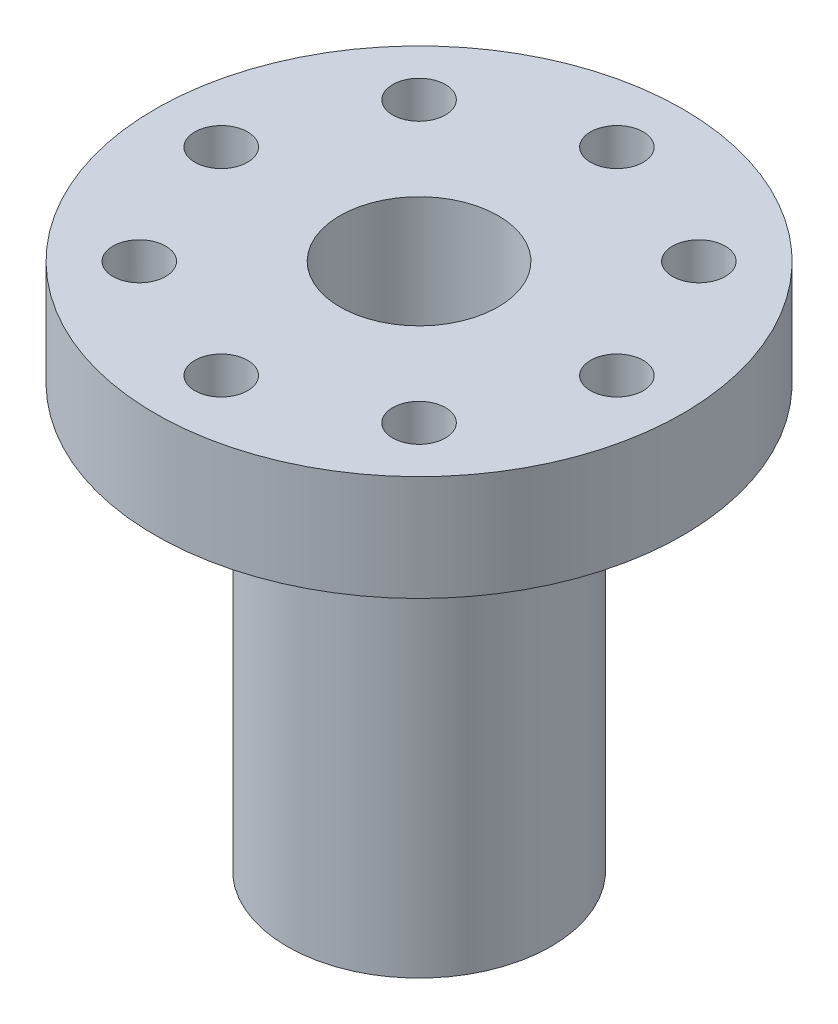
ISO-10303-21;
HEADER;
FILE_DESCRIPTION(('STEP AP214'),'2;1');
FILE_NAME('part.step','',(''),(''),'','','');
FILE_SCHEMA(('AUTOMOTIVE_DESIGN { 1 0 10303 214 1 1 1 1 }'));
ENDSEC;
DATA;
#1=APPLICATION_CONTEXT('core data for automotive mechanical design processes');
#2=APPLICATION_PROTOCOL_DEFINITION('international standard','automotive_design',2000,#1);
#3=PRODUCT_CONTEXT('',#1,'mechanical');
#4=PRODUCT('Part','Part','',(#3));
#5=PRODUCT_RELATED_PRODUCT_CATEGORY('part','',(#4));
#6=PRODUCT_DEFINITION_FORMATION('','',#4);
#7=PRODUCT_DEFINITION_CONTEXT('part definition',#1,'design');
#8=PRODUCT_DEFINITION('design','',#6,#7);
#9=PRODUCT_DEFINITION_SHAPE('','',#8);
#10=(LENGTH_UNIT() NAMED_UNIT(*) SI_UNIT(.MILLI.,.METRE.));
#11=(NAMED_UNIT(*) PLANE_ANGLE_UNIT() SI_UNIT($,.RADIAN.));
#12=(NAMED_UNIT(*) SI_UNIT($,.STERADIAN.) SOLID_ANGLE_UNIT());
#13=UNCERTAINTY_MEASURE_WITH_UNIT(LENGTH_MEASURE(1.E-05),#10,'distance_accuracy_value','');
#14=(GEOMETRIC_REPRESENTATION_CONTEXT(3) GLOBAL_UNCERTAINTY_ASSIGNED_CONTEXT((#13)) GLOBAL_UNIT_ASSIGNED_CONTEXT((#10,
#11,#12)) REPRESENTATION_CONTEXT('',''));
#15=CARTESIAN_POINT('',(0.,0.,0.));
#16=DIRECTION('',(0.,0.,1.));
#17=DIRECTION('',(1.,0.,0.));
#18=AXIS2_PLACEMENT_3D('',#15,#16,#17);
#19=CARTESIAN_POINT('',(0.,0.,0.));
#20=DIRECTION('',(0.,-1.,0.));
#21=DIRECTION('',(0.,0.,-1.));
#22=AXIS2_PLACEMENT_3D('',#19,#20,#21);
#23=CYLINDRICAL_SURFACE('',#22,0.635);
#24=CARTESIAN_POINT('',(0.,4.572,0.));
#25=DIRECTION('',(0.,-1.,0.));
#26=DIRECTION('',(0.,0.,-1.));
#27=AXIS2_PLACEMENT_3D('',#24,#25,#26);
#28=CIRCLE('',#27,0.635);
#29=CARTESIAN_POINT('',(0.,4.572,-0.635));
#30=VERTEX_POINT('',#29);
#31=EDGE_CURVE('E47',#30,#30,#28,.T.);
#32=ORIENTED_EDGE('',*,*,#31,.F.);
#33=EDGE_LOOP('',(#32));
#34=FACE_BOUND('',#33,.T.);
#35=CARTESIAN_POINT('',(0.,3.5052,0.));
#36=DIRECTION('',(0.,-1.,0.));
#37=DIRECTION('',(0.,0.,-1.));
#38=AXIS2_PLACEMENT_3D('',#35,#36,#37);
#39=CIRCLE('',#38,0.635);
#40=CARTESIAN_POINT('',(0.,3.5052,-0.635));
#41=VERTEX_POINT('',#40);
#42=EDGE_CURVE('E51',#41,#41,#39,.T.);
#43=ORIENTED_EDGE('',*,*,#42,.T.);
#44=EDGE_LOOP('',(#43));
#45=FACE_BOUND('',#44,.T.);
#46=ADVANCED_FACE('F34',(#34,#45),#23,.F.);
#47=CARTESIAN_POINT('',(12.7,25.4,0.));
#48=DIRECTION('',(0.,1.,0.));
#49=DIRECTION('',(0.,0.,1.));
#50=AXIS2_PLACEMENT_3D('',#47,#48,#49);
#51=PLANE('',#50);
#52=CARTESIAN_POINT('',(9.525,25.4,0.));
#53=DIRECTION('',(0.,1.,0.));
#54=DIRECTION('',(-1.,0.,0.));
#55=AXIS2_PLACEMENT_3D('',#52,#53,#54);
#56=CIRCLE('',#55,1.27);
#57=CARTESIAN_POINT('',(8.255,25.4,0.));
#58=VERTEX_POINT('',#57);
#59=EDGE_CURVE('E70',#58,#58,#56,.T.);
#60=ORIENTED_EDGE('',*,*,#59,.F.);
#61=EDGE_LOOP('',(#60));
#62=FACE_BOUND('',#61,.T.);
#63=CARTESIAN_POINT('',(6.73519209080183,25.4,6.7351920908019));
#64=DIRECTION('',(0.,1.,0.));
#65=DIRECTION('',(-0.707106781186544,0.,-0.707106781186551));
#66=AXIS2_PLACEMENT_3D('',#63,#64,#65);
#67=CIRCLE('',#66,1.27);
#68=CARTESIAN_POINT('',(5.83716647869492,25.4,5.83716647869498));
#69=VERTEX_POINT('',#68);
#70=EDGE_CURVE('E173',#69,#69,#67,.T.);
#71=ORIENTED_EDGE('',*,*,#70,.F.);
#72=EDGE_LOOP('',(#71));
#73=FACE_BOUND('',#72,.T.);
#74=CARTESIAN_POINT('',(0.,25.4,9.525));
#75=DIRECTION('',(0.,1.,0.));
#76=DIRECTION('',(0.,0.,-1.));
#77=AXIS2_PLACEMENT_3D('',#74,#75,#76);
#78=CIRCLE('',#77,1.27);
#79=CARTESIAN_POINT('',(0.,25.4,8.255));
#80=VERTEX_POINT('',#79);
#81=EDGE_CURVE('E177',#80,#80,#78,.T.);
#82=ORIENTED_EDGE('',*,*,#81,.F.);
#83=EDGE_LOOP('',(#82));
#84=FACE_BOUND('',#83,.T.);
#85=CARTESIAN_POINT('',(-6.73519209080192,25.4,6.73519209080181));
#86=DIRECTION('',(0.,1.,0.));
#87=DIRECTION('',(0.707106781186554,0.,-0.707106781186541));
#88=AXIS2_PLACEMENT_3D('',#85,#86,#87);
#89=CIRCLE('',#88,1.27);
#90=CARTESIAN_POINT('',(-5.837166478695,25.4,5.8371664786949));
#91=VERTEX_POINT('',#90);
#92=EDGE_CURVE('E181',#91,#91,#89,.T.);
#93=ORIENTED_EDGE('',*,*,#92,.F.);
#94=EDGE_LOOP('',(#93));
#95=FACE_BOUND('',#94,.T.);
#96=CARTESIAN_POINT('',(-9.525,25.4,0.));
#97=DIRECTION('',(0.,1.,0.));
#98=DIRECTION('',(1.,0.,0.));
#99=AXIS2_PLACEMENT_3D('',#96,#97,#98);
#100=CIRCLE('',#99,1.27);
#101=CARTESIAN_POINT('',(-8.255,25.4,0.));
#102=VERTEX_POINT('',#101);
#103=EDGE_CURVE('E185',#102,#102,#100,.T.);
#104=ORIENTED_EDGE('',*,*,#103,.F.);
#105=EDGE_LOOP('',(#104));
#106=FACE_BOUND('',#105,.T.);
#107=CARTESIAN_POINT('',(-6.73519209080178,25.4,-6.73519209080195));
#108=DIRECTION('',(0.,1.,0.));
#109=DIRECTION('',(0.707106781186539,0.,0.707106781186556));
#110=AXIS2_PLACEMENT_3D('',#107,#108,#109);
#111=CIRCLE('',#110,1.27);
#112=CARTESIAN_POINT('',(-5.83716647869488,25.4,-5.83716647869502));
#113=VERTEX_POINT('',#112);
#114=EDGE_CURVE('E92',#113,#113,#111,.T.);
#115=ORIENTED_EDGE('',*,*,#114,.F.);
#116=EDGE_LOOP('',(#115));
#117=FACE_BOUND('',#116,.T.);
#118=CARTESIAN_POINT('',(6.73519209080188,25.4,-6.73519209080185));
#119=DIRECTION('',(0.,1.,0.));
#120=DIRECTION('',(-0.707106781186549,0.,0.707106781186546));
#121=AXIS2_PLACEMENT_3D('',#118,#119,#120);
#122=CIRCLE('',#121,1.27);
#123=CARTESIAN_POINT('',(5.83716647869496,25.4,-5.83716647869494));
#124=VERTEX_POINT('',#123);
#125=EDGE_CURVE('E64',#124,#124,#122,.T.);
#126=ORIENTED_EDGE('',*,*,#125,.F.);
#127=EDGE_LOOP('',(#126));
#128=FACE_BOUND('',#127,.T.);
#129=CARTESIAN_POINT('',(0.,25.4,-9.525));
#130=DIRECTION('',(0.,1.,0.));
#131=DIRECTION('',(0.,0.,1.));
#132=AXIS2_PLACEMENT_3D('',#129,#130,#131);
#133=CIRCLE('',#132,1.27);
#134=CARTESIAN_POINT('',(0.,25.4,-8.255));
#135=VERTEX_POINT('',#134);
#136=EDGE_CURVE('E60',#135,#135,#133,.T.);
#137=ORIENTED_EDGE('',*,*,#136,.F.);
#138=EDGE_LOOP('',(#137));
#139=FACE_BOUND('',#138,.T.);
#140=CARTESIAN_POINT('',(0.,25.4,0.));
#141=DIRECTION('',(0.,-1.,0.));
#142=DIRECTION('',(0.,0.,-1.));
#143=AXIS2_PLACEMENT_3D('',#140,#141,#142);
#144=CIRCLE('',#143,3.81);
#145=CARTESIAN_POINT('',(0.,25.4,-3.81));
#146=VERTEX_POINT('',#145);
#147=EDGE_CURVE('E10',#146,#146,#144,.T.);
#148=ORIENTED_EDGE('',*,*,#147,.T.);
#149=EDGE_LOOP('',(#148));
#150=FACE_BOUND('',#149,.T.);
#151=CARTESIAN_POINT('',(0.,25.4,0.));
#152=DIRECTION('',(0.,-1.,0.));
#153=DIRECTION('',(0.,0.,-1.));
#154=AXIS2_PLACEMENT_3D('',#151,#152,#153);
#155=CIRCLE('',#154,12.7);
#156=CARTESIAN_POINT('',(0.,25.4,-12.7));
#157=VERTEX_POINT('',#156);
#158=EDGE_CURVE('E54',#157,#157,#155,.T.);
#159=ORIENTED_EDGE('',*,*,#158,.F.);
#160=EDGE_LOOP('',(#159));
#161=FACE_BOUND('',#160,.T.);
#162=ADVANCED_FACE('F36',(#62,#73,#84,#95,#106,#117,#128,#139,#150,#161),#51,.T.);
#163=CARTESIAN_POINT('',(0.,0.,0.));
#164=DIRECTION('',(0.,-1.,0.));
#165=DIRECTION('',(0.,0.,-1.));
#166=AXIS2_PLACEMENT_3D('',#163,#164,#165);
#167=CYLINDRICAL_SURFACE('',#166,3.81);
#168=CARTESIAN_POINT('',(0.,4.572,0.));
#169=DIRECTION('',(0.,-1.,0.));
#170=DIRECTION('',(0.,0.,-1.));
#171=AXIS2_PLACEMENT_3D('',#168,#169,#170);
#172=CIRCLE('',#171,3.81);
#173=CARTESIAN_POINT('',(0.,4.572,-3.81));
#174=VERTEX_POINT('',#173);
#175=EDGE_CURVE('E42',#174,#174,#172,.T.);
#176=ORIENTED_EDGE('',*,*,#175,.T.);
#177=EDGE_LOOP('',(#176));
#178=FACE_BOUND('',#177,.T.);
#179=ORIENTED_EDGE('',*,*,#147,.F.);
#180=EDGE_LOOP('',(#179));
#181=FACE_BOUND('',#180,.T.);
#182=ADVANCED_FACE('F156',(#178,#181),#167,.F.);
#183=CARTESIAN_POINT('',(3.81,4.572,0.));
#184=DIRECTION('',(0.,1.,0.));
#185=DIRECTION('',(0.,0.,1.));
#186=AXIS2_PLACEMENT_3D('',#183,#184,#185);
#187=PLANE('',#186);
#188=ORIENTED_EDGE('',*,*,#31,.T.);
#189=EDGE_LOOP('',(#188));
#190=FACE_BOUND('',#189,.T.);
#191=ORIENTED_EDGE('',*,*,#175,.F.);
#192=EDGE_LOOP('',(#191));
#193=FACE_BOUND('',#192,.T.);
#194=ADVANCED_FACE('F115',(#190,#193),#187,.T.);
#195=CARTESIAN_POINT('',(0.635000000000001,0.,0.));
#196=DIRECTION('',(0.,-1.,0.));
#197=DIRECTION('',(0.,0.,-1.));
#198=AXIS2_PLACEMENT_3D('',#195,#196,#197);
#199=PLANE('',#198);
#200=CARTESIAN_POINT('',(0.,0.,0.));
#201=DIRECTION('',(0.,-1.,0.));
#202=DIRECTION('',(0.,0.,-1.));
#203=AXIS2_PLACEMENT_3D('',#200,#201,#202);
#204=CIRCLE('',#203,2.54);
#205=CARTESIAN_POINT('',(0.,0.,-2.54));
#206=VERTEX_POINT('',#205);
#207=EDGE_CURVE('E59',#206,#206,#204,.T.);
#208=ORIENTED_EDGE('',*,*,#207,.F.);
#209=EDGE_LOOP('',(#208));
#210=FACE_BOUND('',#209,.T.);
#211=CARTESIAN_POINT('',(0.,0.,0.));
#212=DIRECTION('',(0.,-1.,0.));
#213=DIRECTION('',(0.,0.,-1.));
#214=AXIS2_PLACEMENT_3D('',#211,#212,#213);
#215=CIRCLE('',#214,6.35);
#216=CARTESIAN_POINT('',(0.,0.,-6.35));
#217=VERTEX_POINT('',#216);
#218=EDGE_CURVE('E110',#217,#217,#215,.T.);
#219=ORIENTED_EDGE('',*,*,#218,.T.);
#220=EDGE_LOOP('',(#219));
#221=FACE_BOUND('',#220,.T.);
#222=ADVANCED_FACE('F137',(#210,#221),#199,.T.);
#223=CARTESIAN_POINT('',(0.,0.,0.));
#224=DIRECTION('',(0.,-1.,0.));
#225=DIRECTION('',(0.,0.,-1.));
#226=AXIS2_PLACEMENT_3D('',#223,#224,#225);
#227=CYLINDRICAL_SURFACE('',#226,6.35);
#228=CARTESIAN_POINT('',(0.,20.32,0.));
#229=DIRECTION('',(0.,-1.,0.));
#230=DIRECTION('',(0.,0.,-1.));
#231=AXIS2_PLACEMENT_3D('',#228,#229,#230);
#232=CIRCLE('',#231,6.35);
#233=CARTESIAN_POINT('',(0.,20.32,-6.35));
#234=VERTEX_POINT('',#233);
#235=EDGE_CURVE('E107',#234,#234,#232,.T.);
#236=ORIENTED_EDGE('',*,*,#235,.T.);
#237=EDGE_LOOP('',(#236));
#238=FACE_BOUND('',#237,.T.);
#239=ORIENTED_EDGE('',*,*,#218,.F.);
#240=EDGE_LOOP('',(#239));
#241=FACE_BOUND('',#240,.T.);
#242=ADVANCED_FACE('F140',(#238,#241),#227,.T.);
#243=CARTESIAN_POINT('',(6.35,20.32,0.));
#244=DIRECTION('',(0.,-1.,0.));
#245=DIRECTION('',(0.,0.,-1.));
#246=AXIS2_PLACEMENT_3D('',#243,#244,#245);
#247=PLANE('',#246);
#248=CARTESIAN_POINT('',(9.525,20.32,0.));
#249=DIRECTION('',(0.,-1.,0.));
#250=DIRECTION('',(0.,0.,-1.));
#251=AXIS2_PLACEMENT_3D('',#248,#249,#250);
#252=CIRCLE('',#251,1.27);
#253=CARTESIAN_POINT('',(9.525,20.32,-1.26999999999997));
#254=VERTEX_POINT('',#253);
#255=EDGE_CURVE('E38',#254,#254,#252,.T.);
#256=ORIENTED_EDGE('',*,*,#255,.F.);
#257=EDGE_LOOP('',(#256));
#258=FACE_BOUND('',#257,.T.);
#259=CARTESIAN_POINT('',(6.73519209080183,20.32,6.7351920908019));
#260=DIRECTION('',(0.,-1.,0.));
#261=DIRECTION('',(0.,0.,-1.));
#262=AXIS2_PLACEMENT_3D('',#259,#260,#261);
#263=CIRCLE('',#262,1.27);
#264=CARTESIAN_POINT('',(6.73519209080183,20.32,5.4651920908019));
#265=VERTEX_POINT('',#264);
#266=EDGE_CURVE('E79',#265,#265,#263,.T.);
#267=ORIENTED_EDGE('',*,*,#266,.F.);
#268=EDGE_LOOP('',(#267));
#269=FACE_BOUND('',#268,.T.);
#270=CARTESIAN_POINT('',(0.,20.32,9.525));
#271=DIRECTION('',(0.,-1.,0.));
#272=DIRECTION('',(0.,0.,-1.));
#273=AXIS2_PLACEMENT_3D('',#270,#271,#272);
#274=CIRCLE('',#273,1.27);
#275=CARTESIAN_POINT('',(0.,20.32,8.255));
#276=VERTEX_POINT('',#275);
#277=EDGE_CURVE('E77',#276,#276,#274,.T.);
#278=ORIENTED_EDGE('',*,*,#277,.F.);
#279=EDGE_LOOP('',(#278));
#280=FACE_BOUND('',#279,.T.);
#281=CARTESIAN_POINT('',(-6.73519209080192,20.32,6.73519209080181));
#282=DIRECTION('',(0.,-1.,0.));
#283=DIRECTION('',(0.,0.,-1.));
#284=AXIS2_PLACEMENT_3D('',#281,#282,#283);
#285=CIRCLE('',#284,1.27);
#286=CARTESIAN_POINT('',(-6.73519209080192,20.32,5.46519209080181));
#287=VERTEX_POINT('',#286);
#288=EDGE_CURVE('E74',#287,#287,#285,.T.);
#289=ORIENTED_EDGE('',*,*,#288,.F.);
#290=EDGE_LOOP('',(#289));
#291=FACE_BOUND('',#290,.T.);
#292=CARTESIAN_POINT('',(-9.525,20.32,0.));
#293=DIRECTION('',(0.,-1.,0.));
#294=DIRECTION('',(0.,0.,-1.));
#295=AXIS2_PLACEMENT_3D('',#292,#293,#294);
#296=CIRCLE('',#295,1.27);
#297=CARTESIAN_POINT('',(-9.525,20.32,-1.2700000000001));
#298=VERTEX_POINT('',#297);
#299=EDGE_CURVE('E69',#298,#298,#296,.T.);
#300=ORIENTED_EDGE('',*,*,#299,.F.);
#301=EDGE_LOOP('',(#300));
#302=FACE_BOUND('',#301,.T.);
#303=CARTESIAN_POINT('',(-6.73519209080178,20.32,-6.73519209080195));
#304=DIRECTION('',(0.,-1.,0.));
#305=DIRECTION('',(0.,0.,-1.));
#306=AXIS2_PLACEMENT_3D('',#303,#304,#305);
#307=CIRCLE('',#306,1.27);
#308=CARTESIAN_POINT('',(-6.73519209080178,20.32,-8.00519209080195));
#309=VERTEX_POINT('',#308);
#310=EDGE_CURVE('E65',#309,#309,#307,.T.);
#311=ORIENTED_EDGE('',*,*,#310,.F.);
#312=EDGE_LOOP('',(#311));
#313=FACE_BOUND('',#312,.T.);
#314=CARTESIAN_POINT('',(6.73519209080188,20.32,-6.73519209080185));
#315=DIRECTION('',(0.,-1.,0.));
#316=DIRECTION('',(0.,0.,-1.));
#317=AXIS2_PLACEMENT_3D('',#314,#315,#316);
#318=CIRCLE('',#317,1.27);
#319=CARTESIAN_POINT('',(6.73519209080188,20.32,-8.00519209080186));
#320=VERTEX_POINT('',#319);
#321=EDGE_CURVE('E61',#320,#320,#318,.T.);
#322=ORIENTED_EDGE('',*,*,#321,.F.);
#323=EDGE_LOOP('',(#322));
#324=FACE_BOUND('',#323,.T.);
#325=CARTESIAN_POINT('',(0.,20.32,-9.525));
#326=DIRECTION('',(0.,-1.,0.));
#327=DIRECTION('',(0.,0.,-1.));
#328=AXIS2_PLACEMENT_3D('',#325,#326,#327);
#329=CIRCLE('',#328,1.27);
#330=CARTESIAN_POINT('',(0.,20.32,-10.795));
#331=VERTEX_POINT('',#330);
#332=EDGE_CURVE('E56',#331,#331,#329,.T.);
#333=ORIENTED_EDGE('',*,*,#332,.F.);
#334=EDGE_LOOP('',(#333));
#335=FACE_BOUND('',#334,.T.);
#336=CARTESIAN_POINT('',(0.,20.32,0.));
#337=DIRECTION('',(0.,-1.,0.));
#338=DIRECTION('',(0.,0.,-1.));
#339=AXIS2_PLACEMENT_3D('',#336,#337,#338);
#340=CIRCLE('',#339,12.7);
#341=CARTESIAN_POINT('',(0.,20.32,-12.7));
#342=VERTEX_POINT('',#341);
#343=EDGE_CURVE('E103',#342,#342,#340,.T.);
#344=ORIENTED_EDGE('',*,*,#343,.T.);
#345=EDGE_LOOP('',(#344));
#346=FACE_BOUND('',#345,.T.);
#347=ORIENTED_EDGE('',*,*,#235,.F.);
#348=EDGE_LOOP('',(#347));
#349=FACE_BOUND('',#348,.T.);
#350=ADVANCED_FACE('F145',(#258,#269,#280,#291,#302,#313,#324,#335,#346,#349),#247,.T.);
#351=CARTESIAN_POINT('',(0.,0.,0.));
#352=DIRECTION('',(0.,-1.,0.));
#353=DIRECTION('',(0.,0.,-1.));
#354=AXIS2_PLACEMENT_3D('',#351,#352,#353);
#355=CYLINDRICAL_SURFACE('',#354,12.7);
#356=ORIENTED_EDGE('',*,*,#158,.T.);
#357=EDGE_LOOP('',(#356));
#358=FACE_BOUND('',#357,.T.);
#359=ORIENTED_EDGE('',*,*,#343,.F.);
#360=EDGE_LOOP('',(#359));
#361=FACE_BOUND('',#360,.T.);
#362=ADVANCED_FACE('F133',(#358,#361),#355,.T.);
#363=CARTESIAN_POINT('',(0.,3.5052,0.));
#364=DIRECTION('',(0.,-1.,0.));
#365=DIRECTION('',(0.,0.,-1.));
#366=AXIS2_PLACEMENT_3D('',#363,#364,#365);
#367=CYLINDRICAL_SURFACE('',#366,2.54);
#368=CARTESIAN_POINT('',(0.,3.5052,0.));
#369=DIRECTION('',(0.,-1.,0.));
#370=DIRECTION('',(0.,0.,-1.));
#371=AXIS2_PLACEMENT_3D('',#368,#369,#370);
#372=CIRCLE('',#371,2.54);
#373=CARTESIAN_POINT('',(0.,3.5052,-2.54));
#374=VERTEX_POINT('',#373);
#375=EDGE_CURVE('E55',#374,#374,#372,.T.);
#376=ORIENTED_EDGE('',*,*,#375,.F.);
#377=EDGE_LOOP('',(#376));
#378=FACE_BOUND('',#377,.T.);
#379=ORIENTED_EDGE('',*,*,#207,.T.);
#380=EDGE_LOOP('',(#379));
#381=FACE_BOUND('',#380,.T.);
#382=ADVANCED_FACE('F127',(#378,#381),#367,.F.);
#383=CARTESIAN_POINT('',(0.,3.5052,0.));
#384=DIRECTION('',(0.,-1.,0.));
#385=DIRECTION('',(0.,0.,-1.));
#386=AXIS2_PLACEMENT_3D('',#383,#384,#385);
#387=PLANE('',#386);
#388=ORIENTED_EDGE('',*,*,#42,.F.);
#389=EDGE_LOOP('',(#388));
#390=FACE_BOUND('',#389,.T.);
#391=ORIENTED_EDGE('',*,*,#375,.T.);
#392=EDGE_LOOP('',(#391));
#393=FACE_BOUND('',#392,.T.);
#394=ADVANCED_FACE('F123',(#390,#393),#387,.T.);
#395=CARTESIAN_POINT('',(0.,0.,-9.525));
#396=DIRECTION('',(0.,1.,0.));
#397=DIRECTION('',(0.,0.,1.));
#398=AXIS2_PLACEMENT_3D('',#395,#396,#397);
#399=CYLINDRICAL_SURFACE('',#398,1.27);
#400=ORIENTED_EDGE('',*,*,#332,.T.);
#401=EDGE_LOOP('',(#400));
#402=FACE_BOUND('',#401,.T.);
#403=ORIENTED_EDGE('',*,*,#136,.T.);
#404=EDGE_LOOP('',(#403));
#405=FACE_BOUND('',#404,.T.);
#406=ADVANCED_FACE('F126',(#402,#405),#399,.F.);
#407=CARTESIAN_POINT('',(6.73519209080188,0.,-6.73519209080185));
#408=DIRECTION('',(0.,1.,0.));
#409=DIRECTION('',(0.,0.,1.));
#410=AXIS2_PLACEMENT_3D('',#407,#408,#409);
#411=CYLINDRICAL_SURFACE('',#410,1.27);
#412=ORIENTED_EDGE('',*,*,#321,.T.);
#413=EDGE_LOOP('',(#412));
#414=FACE_BOUND('',#413,.T.);
#415=ORIENTED_EDGE('',*,*,#125,.T.);
#416=EDGE_LOOP('',(#415));
#417=FACE_BOUND('',#416,.T.);
#418=ADVANCED_FACE('F205',(#414,#417),#411,.F.);
#419=CARTESIAN_POINT('',(-6.73519209080178,0.,-6.73519209080195));
#420=DIRECTION('',(0.,1.,0.));
#421=DIRECTION('',(0.,0.,1.));
#422=AXIS2_PLACEMENT_3D('',#419,#420,#421);
#423=CYLINDRICAL_SURFACE('',#422,1.27);
#424=ORIENTED_EDGE('',*,*,#310,.T.);
#425=EDGE_LOOP('',(#424));
#426=FACE_BOUND('',#425,.T.);
#427=ORIENTED_EDGE('',*,*,#114,.T.);
#428=EDGE_LOOP('',(#427));
#429=FACE_BOUND('',#428,.T.);
#430=ADVANCED_FACE('F209',(#426,#429),#423,.F.);
#431=CARTESIAN_POINT('',(-9.525,0.,0.));
#432=DIRECTION('',(0.,1.,0.));
#433=DIRECTION('',(0.,0.,1.));
#434=AXIS2_PLACEMENT_3D('',#431,#432,#433);
#435=CYLINDRICAL_SURFACE('',#434,1.27);
#436=ORIENTED_EDGE('',*,*,#299,.T.);
#437=EDGE_LOOP('',(#436));
#438=FACE_BOUND('',#437,.T.);
#439=ORIENTED_EDGE('',*,*,#103,.T.);
#440=EDGE_LOOP('',(#439));
#441=FACE_BOUND('',#440,.T.);
#442=ADVANCED_FACE('F213',(#438,#441),#435,.F.);
#443=CARTESIAN_POINT('',(-6.73519209080192,0.,6.73519209080181));
#444=DIRECTION('',(0.,1.,0.));
#445=DIRECTION('',(0.,0.,1.));
#446=AXIS2_PLACEMENT_3D('',#443,#444,#445);
#447=CYLINDRICAL_SURFACE('',#446,1.27);
#448=ORIENTED_EDGE('',*,*,#288,.T.);
#449=EDGE_LOOP('',(#448));
#450=FACE_BOUND('',#449,.T.);
#451=ORIENTED_EDGE('',*,*,#92,.T.);
#452=EDGE_LOOP('',(#451));
#453=FACE_BOUND('',#452,.T.);
#454=ADVANCED_FACE('F217',(#450,#453),#447,.F.);
#455=CARTESIAN_POINT('',(0.,0.,9.525));
#456=DIRECTION('',(0.,1.,0.));
#457=DIRECTION('',(0.,0.,1.));
#458=AXIS2_PLACEMENT_3D('',#455,#456,#457);
#459=CYLINDRICAL_SURFACE('',#458,1.27);
#460=ORIENTED_EDGE('',*,*,#277,.T.);
#461=EDGE_LOOP('',(#460));
#462=FACE_BOUND('',#461,.T.);
#463=ORIENTED_EDGE('',*,*,#81,.T.);
#464=EDGE_LOOP('',(#463));
#465=FACE_BOUND('',#464,.T.);
#466=ADVANCED_FACE('F221',(#462,#465),#459,.F.);
#467=CARTESIAN_POINT('',(6.73519209080183,0.,6.7351920908019));
#468=DIRECTION('',(0.,1.,0.));
#469=DIRECTION('',(0.,0.,1.));
#470=AXIS2_PLACEMENT_3D('',#467,#468,#469);
#471=CYLINDRICAL_SURFACE('',#470,1.27);
#472=ORIENTED_EDGE('',*,*,#266,.T.);
#473=EDGE_LOOP('',(#472));
#474=FACE_BOUND('',#473,.T.);
#475=ORIENTED_EDGE('',*,*,#70,.T.);
#476=EDGE_LOOP('',(#475));
#477=FACE_BOUND('',#476,.T.);
#478=ADVANCED_FACE('F225',(#474,#477),#471,.F.);
#479=CARTESIAN_POINT('',(9.525,0.,0.));
#480=DIRECTION('',(0.,1.,0.));
#481=DIRECTION('',(0.,0.,1.));
#482=AXIS2_PLACEMENT_3D('',#479,#480,#481);
#483=CYLINDRICAL_SURFACE('',#482,1.27);
#484=ORIENTED_EDGE('',*,*,#255,.T.);
#485=EDGE_LOOP('',(#484));
#486=FACE_BOUND('',#485,.T.);
#487=ORIENTED_EDGE('',*,*,#59,.T.);
#488=EDGE_LOOP('',(#487));
#489=FACE_BOUND('',#488,.T.);
#490=ADVANCED_FACE('F229',(#486,#489),#483,.F.);
#491=CLOSED_SHELL('',(#46,#162,#182,#194,#222,#242,#350,#362,#382,#394,#406,#418,#430,#442,#454,
#466,#478,#490));
#492=MANIFOLD_SOLID_BREP('B2',#491);
#493=ADVANCED_BREP_SHAPE_REPRESENTATION('',(#18,#492),#14);
#494=SHAPE_DEFINITION_REPRESENTATION(#9,#493);
ENDSEC;
END-ISO-10303-21;
